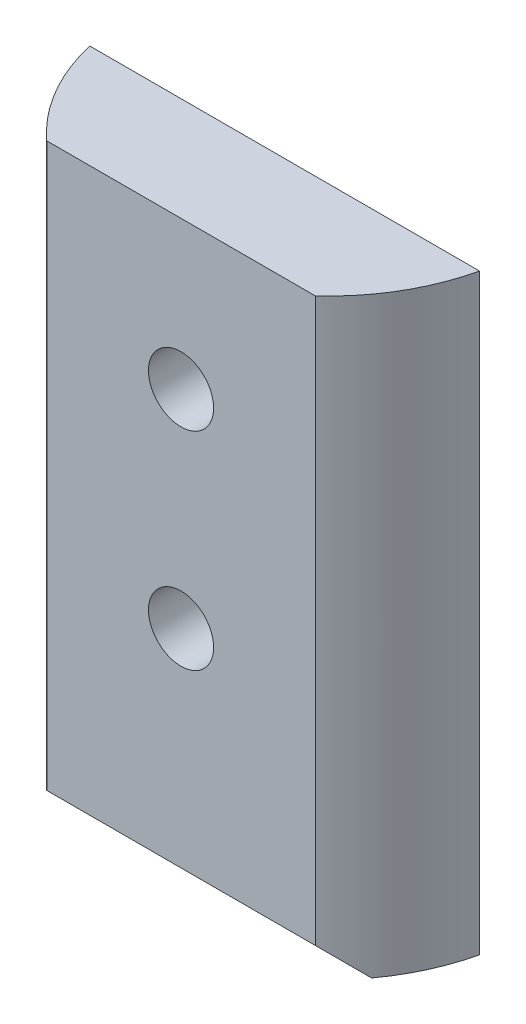
ISO-10303-21;
HEADER;
FILE_DESCRIPTION(('STEP AP214'),'2;1');
FILE_NAME('part.step','',(''),(''),'','','');
FILE_SCHEMA(('AUTOMOTIVE_DESIGN { 1 0 10303 214 1 1 1 1 }'));
ENDSEC;
DATA;
#1=APPLICATION_CONTEXT('core data for automotive mechanical design processes');
#2=APPLICATION_PROTOCOL_DEFINITION('international standard','automotive_design',2000,#1);
#3=PRODUCT_CONTEXT('',#1,'mechanical');
#4=PRODUCT('Part','Part','',(#3));
#5=PRODUCT_RELATED_PRODUCT_CATEGORY('part','',(#4));
#6=PRODUCT_DEFINITION_FORMATION('','',#4);
#7=PRODUCT_DEFINITION_CONTEXT('part definition',#1,'design');
#8=PRODUCT_DEFINITION('design','',#6,#7);
#9=PRODUCT_DEFINITION_SHAPE('','',#8);
#10=(LENGTH_UNIT() NAMED_UNIT(*) SI_UNIT(.MILLI.,.METRE.));
#11=(NAMED_UNIT(*) PLANE_ANGLE_UNIT() SI_UNIT($,.RADIAN.));
#12=(NAMED_UNIT(*) SI_UNIT($,.STERADIAN.) SOLID_ANGLE_UNIT());
#13=UNCERTAINTY_MEASURE_WITH_UNIT(LENGTH_MEASURE(1.E-05),#10,'distance_accuracy_value','');
#14=(GEOMETRIC_REPRESENTATION_CONTEXT(3) GLOBAL_UNCERTAINTY_ASSIGNED_CONTEXT((#13)) GLOBAL_UNIT_ASSIGNED_CONTEXT((#10,
#11,#12)) REPRESENTATION_CONTEXT('',''));
#15=CARTESIAN_POINT('',(0.,0.,0.));
#16=DIRECTION('',(0.,0.,1.));
#17=DIRECTION('',(1.,0.,0.));
#18=AXIS2_PLACEMENT_3D('',#15,#16,#17);
#19=CARTESIAN_POINT('',(0.,20.,5.));
#20=DIRECTION('',(0.,0.,-1.));
#21=DIRECTION('',(-1.,0.,0.));
#22=AXIS2_PLACEMENT_3D('',#19,#20,#21);
#23=PLANE('',#22);
#24=CARTESIAN_POINT('',(0.,15.,5.));
#25=DIRECTION('',(0.,0.,1.));
#26=DIRECTION('',(1.,0.,0.));
#27=AXIS2_PLACEMENT_3D('',#24,#25,#26);
#28=CIRCLE('',#27,1.1);
#29=CARTESIAN_POINT('',(1.1,15.,5.));
#30=VERTEX_POINT('',#29);
#31=EDGE_CURVE('E141',#30,#30,#28,.T.);
#32=ORIENTED_EDGE('',*,*,#31,.F.);
#33=EDGE_LOOP('',(#32));
#34=FACE_BOUND('',#33,.T.);
#35=CARTESIAN_POINT('',(0.,8.,5.));
#36=DIRECTION('',(0.,0.,1.));
#37=DIRECTION('',(1.,0.,0.));
#38=AXIS2_PLACEMENT_3D('',#35,#36,#37);
#39=CIRCLE('',#38,1.1);
#40=CARTESIAN_POINT('',(1.1,8.,5.));
#41=VERTEX_POINT('',#40);
#42=EDGE_CURVE('E165',#41,#41,#39,.T.);
#43=ORIENTED_EDGE('',*,*,#42,.F.);
#44=EDGE_LOOP('',(#43));
#45=FACE_BOUND('',#44,.T.);
#46=DIRECTION('',(0.,-1.,0.));
#47=VECTOR('',#46,1.);
#48=CARTESIAN_POINT('',(-4.53458928680426,20.,5.));
#49=LINE('',#48,#47);
#50=CARTESIAN_POINT('',(-4.53458928680426,20.,5.));
#51=VERTEX_POINT('',#50);
#52=CARTESIAN_POINT('',(-4.53458928680426,1.,5.));
#53=VERTEX_POINT('',#52);
#54=EDGE_CURVE('E174',#51,#53,#49,.T.);
#55=ORIENTED_EDGE('',*,*,#54,.T.);
#56=DIRECTION('',(1.,0.,0.));
#57=VECTOR('',#56,1.);
#58=CARTESIAN_POINT('',(0.,1.,5.));
#59=LINE('',#58,#57);
#60=CARTESIAN_POINT('',(4.53458928680426,1.,5.));
#61=VERTEX_POINT('',#60);
#62=EDGE_CURVE('E123',#53,#61,#59,.T.);
#63=ORIENTED_EDGE('',*,*,#62,.T.);
#64=DIRECTION('',(0.,-1.,0.));
#65=VECTOR('',#64,1.);
#66=CARTESIAN_POINT('',(4.53458928680426,20.,5.));
#67=LINE('',#66,#65);
#68=CARTESIAN_POINT('',(4.53458928680426,20.,5.));
#69=VERTEX_POINT('',#68);
#70=EDGE_CURVE('E101',#69,#61,#67,.T.);
#71=ORIENTED_EDGE('',*,*,#70,.F.);
#72=DIRECTION('',(1.,0.,0.));
#73=VECTOR('',#72,1.);
#74=CARTESIAN_POINT('',(0.,20.,5.));
#75=LINE('',#74,#73);
#76=EDGE_CURVE('E109',#51,#69,#75,.T.);
#77=ORIENTED_EDGE('',*,*,#76,.F.);
#78=EDGE_LOOP('',(#55,#63,#71,#77));
#79=FACE_BOUND('',#78,.T.);
#80=ADVANCED_FACE('F51',(#34,#45,#79),#23,.F.);
#81=CARTESIAN_POINT('',(0.,20.,0.));
#82=DIRECTION('',(0.,-1.,0.));
#83=DIRECTION('',(0.,0.,-1.));
#84=AXIS2_PLACEMENT_3D('',#81,#82,#83);
#85=CYLINDRICAL_SURFACE('',#84,6.75);
#86=ORIENTED_EDGE('',*,*,#70,.T.);
#87=CARTESIAN_POINT('',(0.,-3.99999999999998,0.));
#88=DIRECTION('',(0.,0.707106781186549,-0.707106781186546));
#89=DIRECTION('',(0.,-0.707106781186546,-0.707106781186549));
#90=AXIS2_PLACEMENT_3D('',#87,#88,#89);
#91=ELLIPSE('',#90,9.54594154601837,6.75);
#92=CARTESIAN_POINT('',(5.43714079273289,0.,4.));
#93=VERTEX_POINT('',#92);
#94=EDGE_CURVE('E75',#61,#93,#91,.T.);
#95=ORIENTED_EDGE('',*,*,#94,.T.);
#96=CARTESIAN_POINT('',(0.,0.,0.));
#97=DIRECTION('',(0.,1.,0.));
#98=DIRECTION('',(0.,0.,1.));
#99=AXIS2_PLACEMENT_3D('',#96,#97,#98);
#100=CIRCLE('',#99,6.75);
#101=CARTESIAN_POINT('',(6.58122329054409,0.,1.5));
#102=VERTEX_POINT('',#101);
#103=EDGE_CURVE('E143',#93,#102,#100,.T.);
#104=ORIENTED_EDGE('',*,*,#103,.T.);
#105=DIRECTION('',(0.,-1.,0.));
#106=VECTOR('',#105,1.);
#107=CARTESIAN_POINT('',(6.58122329054409,20.,1.5));
#108=LINE('',#107,#106);
#109=CARTESIAN_POINT('',(6.58122329054409,20.,1.5));
#110=VERTEX_POINT('',#109);
#111=EDGE_CURVE('E103',#110,#102,#108,.T.);
#112=ORIENTED_EDGE('',*,*,#111,.F.);
#113=CARTESIAN_POINT('',(0.,20.,0.));
#114=DIRECTION('',(0.,1.,0.));
#115=DIRECTION('',(0.,0.,1.));
#116=AXIS2_PLACEMENT_3D('',#113,#114,#115);
#117=CIRCLE('',#116,6.75);
#118=EDGE_CURVE('E97',#69,#110,#117,.T.);
#119=ORIENTED_EDGE('',*,*,#118,.F.);
#120=EDGE_LOOP('',(#86,#95,#104,#112,#119));
#121=FACE_BOUND('',#120,.T.);
#122=ADVANCED_FACE('F99',(#121),#85,.T.);
#123=CARTESIAN_POINT('',(0.,20.,1.5));
#124=DIRECTION('',(0.,0.,-1.));
#125=DIRECTION('',(-1.,0.,0.));
#126=AXIS2_PLACEMENT_3D('',#123,#124,#125);
#127=PLANE('',#126);
#128=CARTESIAN_POINT('',(0.,15.,1.5));
#129=DIRECTION('',(0.,0.,-1.));
#130=DIRECTION('',(-1.,0.,0.));
#131=AXIS2_PLACEMENT_3D('',#128,#129,#130);
#132=CIRCLE('',#131,1.1);
#133=CARTESIAN_POINT('',(-1.1,15.,1.5));
#134=VERTEX_POINT('',#133);
#135=EDGE_CURVE('E140',#134,#134,#132,.T.);
#136=ORIENTED_EDGE('',*,*,#135,.F.);
#137=EDGE_LOOP('',(#136));
#138=FACE_BOUND('',#137,.T.);
#139=CARTESIAN_POINT('',(0.,8.,1.5));
#140=DIRECTION('',(0.,0.,-1.));
#141=DIRECTION('',(-1.,0.,0.));
#142=AXIS2_PLACEMENT_3D('',#139,#140,#141);
#143=CIRCLE('',#142,1.1);
#144=CARTESIAN_POINT('',(-1.1,8.,1.5));
#145=VERTEX_POINT('',#144);
#146=EDGE_CURVE('E136',#145,#145,#143,.T.);
#147=ORIENTED_EDGE('',*,*,#146,.F.);
#148=EDGE_LOOP('',(#147));
#149=FACE_BOUND('',#148,.T.);
#150=DIRECTION('',(1.,0.,0.));
#151=VECTOR('',#150,1.);
#152=CARTESIAN_POINT('',(0.,0.,1.5));
#153=LINE('',#152,#151);
#154=CARTESIAN_POINT('',(-6.58122329054409,0.,1.5));
#155=VERTEX_POINT('',#154);
#156=EDGE_CURVE('E151',#155,#102,#153,.T.);
#157=ORIENTED_EDGE('',*,*,#156,.F.);
#158=DIRECTION('',(0.,-1.,0.));
#159=VECTOR('',#158,1.);
#160=CARTESIAN_POINT('',(-6.58122329054409,20.,1.5));
#161=LINE('',#160,#159);
#162=CARTESIAN_POINT('',(-6.58122329054409,20.,1.5));
#163=VERTEX_POINT('',#162);
#164=EDGE_CURVE('E132',#163,#155,#161,.T.);
#165=ORIENTED_EDGE('',*,*,#164,.F.);
#166=DIRECTION('',(1.,0.,0.));
#167=VECTOR('',#166,1.);
#168=CARTESIAN_POINT('',(0.,20.,1.5));
#169=LINE('',#168,#167);
#170=EDGE_CURVE('E108',#163,#110,#169,.T.);
#171=ORIENTED_EDGE('',*,*,#170,.T.);
#172=ORIENTED_EDGE('',*,*,#111,.T.);
#173=EDGE_LOOP('',(#157,#165,#171,#172));
#174=FACE_BOUND('',#173,.T.);
#175=ADVANCED_FACE('F191',(#138,#149,#174),#127,.T.);
#176=CARTESIAN_POINT('',(-5.43714079273289,0.,4.));
#177=VERTEX_POINT('',#176);
#178=EDGE_CURVE('E119',#155,#177,#100,.T.);
#179=ORIENTED_EDGE('',*,*,#178,.T.);
#180=CARTESIAN_POINT('',(0.,-3.99999999999998,0.));
#181=DIRECTION('',(0.,0.707106781186549,-0.707106781186546));
#182=DIRECTION('',(0.,-0.707106781186546,-0.707106781186549));
#183=AXIS2_PLACEMENT_3D('',#180,#181,#182);
#184=ELLIPSE('',#183,9.54594154601837,6.75);
#185=EDGE_CURVE('E11',#177,#53,#184,.T.);
#186=ORIENTED_EDGE('',*,*,#185,.T.);
#187=ORIENTED_EDGE('',*,*,#54,.F.);
#188=EDGE_CURVE('E111',#163,#51,#117,.T.);
#189=ORIENTED_EDGE('',*,*,#188,.F.);
#190=ORIENTED_EDGE('',*,*,#164,.T.);
#191=EDGE_LOOP('',(#179,#186,#187,#189,#190));
#192=FACE_BOUND('',#191,.T.);
#193=ADVANCED_FACE('F187',(#192),#85,.T.);
#194=CARTESIAN_POINT('',(0.,20.,0.));
#195=DIRECTION('',(0.,1.,0.));
#196=DIRECTION('',(0.,0.,1.));
#197=AXIS2_PLACEMENT_3D('',#194,#195,#196);
#198=PLANE('',#197);
#199=ORIENTED_EDGE('',*,*,#76,.T.);
#200=ORIENTED_EDGE('',*,*,#118,.T.);
#201=ORIENTED_EDGE('',*,*,#170,.F.);
#202=ORIENTED_EDGE('',*,*,#188,.T.);
#203=EDGE_LOOP('',(#199,#200,#201,#202));
#204=FACE_BOUND('',#203,.T.);
#205=ADVANCED_FACE('F113',(#204),#198,.T.);
#206=CARTESIAN_POINT('',(0.,0.,0.));
#207=DIRECTION('',(0.,1.,0.));
#208=DIRECTION('',(0.,0.,1.));
#209=AXIS2_PLACEMENT_3D('',#206,#207,#208);
#210=PLANE('',#209);
#211=ORIENTED_EDGE('',*,*,#103,.F.);
#212=DIRECTION('',(-1.,0.,0.));
#213=VECTOR('',#212,1.);
#214=CARTESIAN_POINT('',(0.,0.,4.));
#215=LINE('',#214,#213);
#216=EDGE_CURVE('E61',#93,#177,#215,.T.);
#217=ORIENTED_EDGE('',*,*,#216,.T.);
#218=ORIENTED_EDGE('',*,*,#178,.F.);
#219=ORIENTED_EDGE('',*,*,#156,.T.);
#220=EDGE_LOOP('',(#211,#217,#218,#219));
#221=FACE_BOUND('',#220,.T.);
#222=ADVANCED_FACE('F190',(#221),#210,.F.);
#223=CARTESIAN_POINT('',(0.,8.,-15.));
#224=DIRECTION('',(0.,0.,1.));
#225=DIRECTION('',(1.,0.,0.));
#226=AXIS2_PLACEMENT_3D('',#223,#224,#225);
#227=CYLINDRICAL_SURFACE('',#226,1.1);
#228=ORIENTED_EDGE('',*,*,#146,.T.);
#229=EDGE_LOOP('',(#228));
#230=FACE_BOUND('',#229,.T.);
#231=ORIENTED_EDGE('',*,*,#42,.T.);
#232=EDGE_LOOP('',(#231));
#233=FACE_BOUND('',#232,.T.);
#234=ADVANCED_FACE('F210',(#230,#233),#227,.F.);
#235=CARTESIAN_POINT('',(0.,15.,-15.));
#236=DIRECTION('',(0.,0.,1.));
#237=DIRECTION('',(1.,0.,0.));
#238=AXIS2_PLACEMENT_3D('',#235,#236,#237);
#239=CYLINDRICAL_SURFACE('',#238,1.1);
#240=ORIENTED_EDGE('',*,*,#135,.T.);
#241=EDGE_LOOP('',(#240));
#242=FACE_BOUND('',#241,.T.);
#243=ORIENTED_EDGE('',*,*,#31,.T.);
#244=EDGE_LOOP('',(#243));
#245=FACE_BOUND('',#244,.T.);
#246=ADVANCED_FACE('F212',(#242,#245),#239,.F.);
#247=CARTESIAN_POINT('',(0.,1.,5.));
#248=DIRECTION('',(0.,0.707106781186549,-0.707106781186546));
#249=DIRECTION('',(1.,0.,0.));
#250=AXIS2_PLACEMENT_3D('',#247,#248,#249);
#251=PLANE('',#250);
#252=ORIENTED_EDGE('',*,*,#185,.F.);
#253=ORIENTED_EDGE('',*,*,#216,.F.);
#254=ORIENTED_EDGE('',*,*,#94,.F.);
#255=ORIENTED_EDGE('',*,*,#62,.F.);
#256=EDGE_LOOP('',(#252,#253,#254,#255));
#257=FACE_BOUND('',#256,.T.);
#258=ADVANCED_FACE('F54',(#257),#251,.F.);
#259=CLOSED_SHELL('',(#80,#122,#175,#193,#205,#222,#234,#246,#258));
#260=MANIFOLD_SOLID_BREP('B2',#259);
#261=ADVANCED_BREP_SHAPE_REPRESENTATION('',(#18,#260),#14);
#262=SHAPE_DEFINITION_REPRESENTATION(#9,#261);
ENDSEC;
END-ISO-10303-21;
